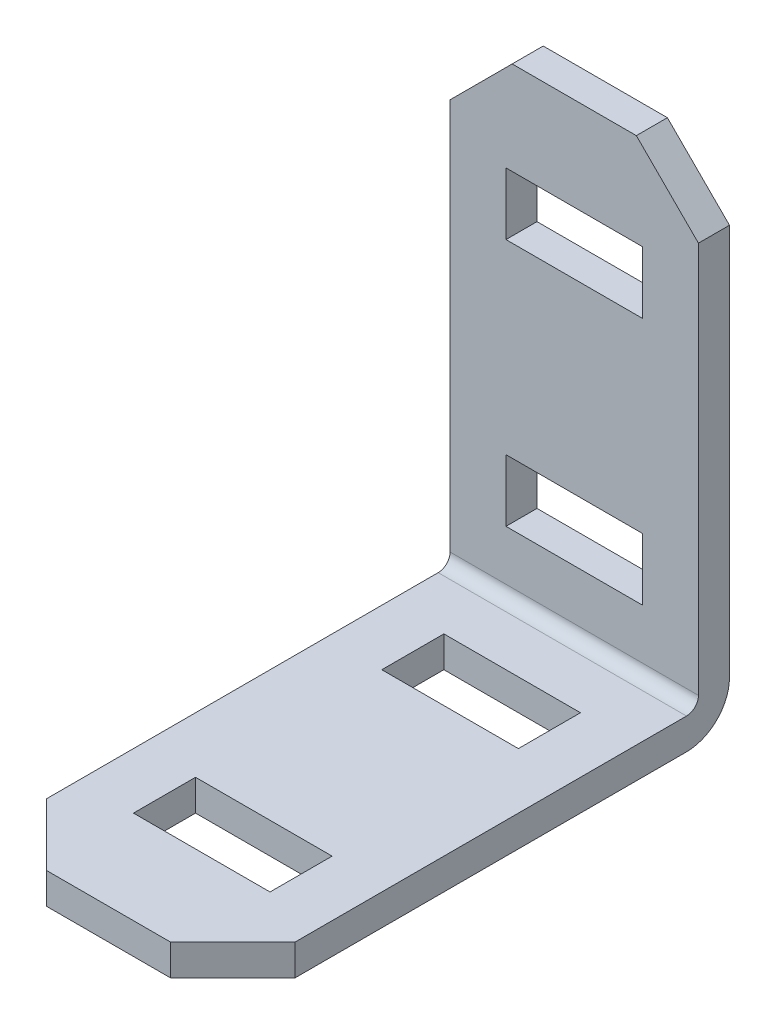
ISO-10303-21;
HEADER;
FILE_DESCRIPTION(('STEP AP214'),'2;1');
FILE_NAME('part.step','',(''),(''),'','','');
FILE_SCHEMA(('AUTOMOTIVE_DESIGN { 1 0 10303 214 1 1 1 1 }'));
ENDSEC;
DATA;
#1=APPLICATION_CONTEXT('core data for automotive mechanical design processes');
#2=APPLICATION_PROTOCOL_DEFINITION('international standard','automotive_design',2000,#1);
#3=PRODUCT_CONTEXT('',#1,'mechanical');
#4=PRODUCT('Part','Part','',(#3));
#5=PRODUCT_RELATED_PRODUCT_CATEGORY('part','',(#4));
#6=PRODUCT_DEFINITION_FORMATION('','',#4);
#7=PRODUCT_DEFINITION_CONTEXT('part definition',#1,'design');
#8=PRODUCT_DEFINITION('design','',#6,#7);
#9=PRODUCT_DEFINITION_SHAPE('','',#8);
#10=(LENGTH_UNIT() NAMED_UNIT(*) SI_UNIT(.MILLI.,.METRE.));
#11=(NAMED_UNIT(*) PLANE_ANGLE_UNIT() SI_UNIT($,.RADIAN.));
#12=(NAMED_UNIT(*) SI_UNIT($,.STERADIAN.) SOLID_ANGLE_UNIT());
#13=UNCERTAINTY_MEASURE_WITH_UNIT(LENGTH_MEASURE(1.E-05),#10,'distance_accuracy_value','');
#14=(GEOMETRIC_REPRESENTATION_CONTEXT(3) GLOBAL_UNCERTAINTY_ASSIGNED_CONTEXT((#13)) GLOBAL_UNIT_ASSIGNED_CONTEXT((#10,
#11,#12)) REPRESENTATION_CONTEXT('',''));
#15=CARTESIAN_POINT('',(0.,0.,0.));
#16=DIRECTION('',(0.,0.,1.));
#17=DIRECTION('',(1.,0.,0.));
#18=AXIS2_PLACEMENT_3D('',#15,#16,#17);
#19=CARTESIAN_POINT('',(0.,0.,0.));
#20=DIRECTION('',(0.,1.,0.));
#21=DIRECTION('',(0.,0.,1.));
#22=AXIS2_PLACEMENT_3D('',#19,#20,#21);
#23=PLANE('',#22);
#24=DIRECTION('',(-0.707106781186549,0.,0.707106781186546));
#25=VECTOR('',#24,1.);
#26=CARTESIAN_POINT('',(25.4,0.,-6.35000000000002));
#27=LINE('',#26,#25);
#28=CARTESIAN_POINT('',(25.4,0.,-6.35000000000002));
#29=VERTEX_POINT('',#28);
#30=CARTESIAN_POINT('',(19.0499999999999,0.,0.));
#31=VERTEX_POINT('',#30);
#32=EDGE_CURVE('E249',#29,#31,#27,.T.);
#33=ORIENTED_EDGE('',*,*,#32,.T.);
#34=DIRECTION('',(-1.,0.,0.));
#35=VECTOR('',#34,1.);
#36=CARTESIAN_POINT('',(0.,0.,0.));
#37=LINE('',#36,#35);
#38=CARTESIAN_POINT('',(6.35000000000001,0.,0.));
#39=VERTEX_POINT('',#38);
#40=EDGE_CURVE('E262',#31,#39,#37,.T.);
#41=ORIENTED_EDGE('',*,*,#40,.T.);
#42=DIRECTION('',(-0.707106781186547,0.,-0.707106781186548));
#43=VECTOR('',#42,1.);
#44=CARTESIAN_POINT('',(6.35000000000001,0.,0.));
#45=LINE('',#44,#43);
#46=CARTESIAN_POINT('',(0.,0.,-6.35000000000003));
#47=VERTEX_POINT('',#46);
#48=EDGE_CURVE('E62',#39,#47,#45,.T.);
#49=ORIENTED_EDGE('',*,*,#48,.T.);
#50=DIRECTION('',(0.,0.,-1.));
#51=VECTOR('',#50,1.);
#52=CARTESIAN_POINT('',(0.,0.,-50.8));
#53=LINE('',#52,#51);
#54=CARTESIAN_POINT('',(0.,0.,-46.4058));
#55=VERTEX_POINT('',#54);
#56=EDGE_CURVE('E56',#47,#55,#53,.T.);
#57=ORIENTED_EDGE('',*,*,#56,.T.);
#58=DIRECTION('',(-1.,0.,0.));
#59=VECTOR('',#58,1.);
#60=CARTESIAN_POINT('',(0.,0.,-46.4058));
#61=LINE('',#60,#59);
#62=CARTESIAN_POINT('',(25.4,0.,-46.4058));
#63=VERTEX_POINT('',#62);
#64=EDGE_CURVE('E300',#63,#55,#61,.T.);
#65=ORIENTED_EDGE('',*,*,#64,.F.);
#66=DIRECTION('',(0.,0.,1.));
#67=VECTOR('',#66,1.);
#68=CARTESIAN_POINT('',(25.4,0.,-50.8));
#69=LINE('',#68,#67);
#70=EDGE_CURVE('E239',#63,#29,#69,.T.);
#71=ORIENTED_EDGE('',*,*,#70,.T.);
#72=EDGE_LOOP('',(#33,#41,#49,#57,#65,#71));
#73=FACE_BOUND('',#72,.T.);
#74=DIRECTION('',(0.,0.,-1.));
#75=VECTOR('',#74,1.);
#76=CARTESIAN_POINT('',(19.685,0.,-15.875));
#77=LINE('',#76,#75);
#78=CARTESIAN_POINT('',(19.685,0.,-9.525));
#79=VERTEX_POINT('',#78);
#80=CARTESIAN_POINT('',(19.685,0.,-15.875));
#81=VERTEX_POINT('',#80);
#82=EDGE_CURVE('E278',#79,#81,#77,.T.);
#83=ORIENTED_EDGE('',*,*,#82,.T.);
#84=DIRECTION('',(-1.,0.,0.));
#85=VECTOR('',#84,1.);
#86=CARTESIAN_POINT('',(19.685,0.,-15.875));
#87=LINE('',#86,#85);
#88=CARTESIAN_POINT('',(5.71499999999999,0.,-15.875));
#89=VERTEX_POINT('',#88);
#90=EDGE_CURVE('E259',#81,#89,#87,.T.);
#91=ORIENTED_EDGE('',*,*,#90,.T.);
#92=DIRECTION('',(0.,0.,1.));
#93=VECTOR('',#92,1.);
#94=CARTESIAN_POINT('',(5.71499999999999,0.,-15.875));
#95=LINE('',#94,#93);
#96=CARTESIAN_POINT('',(5.71499999999999,0.,-9.525));
#97=VERTEX_POINT('',#96);
#98=EDGE_CURVE('E268',#89,#97,#95,.T.);
#99=ORIENTED_EDGE('',*,*,#98,.T.);
#100=DIRECTION('',(1.,0.,0.));
#101=VECTOR('',#100,1.);
#102=CARTESIAN_POINT('',(19.685,0.,-9.525));
#103=LINE('',#102,#101);
#104=EDGE_CURVE('E273',#97,#79,#103,.T.);
#105=ORIENTED_EDGE('',*,*,#104,.T.);
#106=EDGE_LOOP('',(#83,#91,#99,#105));
#107=FACE_BOUND('',#106,.T.);
#108=DIRECTION('',(0.,0.,-1.));
#109=VECTOR('',#108,1.);
#110=CARTESIAN_POINT('',(19.685,0.,-41.275));
#111=LINE('',#110,#109);
#112=CARTESIAN_POINT('',(19.685,0.,-34.925));
#113=VERTEX_POINT('',#112);
#114=CARTESIAN_POINT('',(19.685,0.,-41.275));
#115=VERTEX_POINT('',#114);
#116=EDGE_CURVE('E298',#113,#115,#111,.T.);
#117=ORIENTED_EDGE('',*,*,#116,.T.);
#118=DIRECTION('',(-1.,0.,0.));
#119=VECTOR('',#118,1.);
#120=CARTESIAN_POINT('',(19.685,0.,-41.275));
#121=LINE('',#120,#119);
#122=CARTESIAN_POINT('',(5.71499999999999,0.,-41.275));
#123=VERTEX_POINT('',#122);
#124=EDGE_CURVE('E280',#115,#123,#121,.T.);
#125=ORIENTED_EDGE('',*,*,#124,.T.);
#126=DIRECTION('',(0.,0.,1.));
#127=VECTOR('',#126,1.);
#128=CARTESIAN_POINT('',(5.71499999999999,0.,-41.275));
#129=LINE('',#128,#127);
#130=CARTESIAN_POINT('',(5.71499999999999,0.,-34.925));
#131=VERTEX_POINT('',#130);
#132=EDGE_CURVE('E288',#123,#131,#129,.T.);
#133=ORIENTED_EDGE('',*,*,#132,.T.);
#134=DIRECTION('',(1.,0.,0.));
#135=VECTOR('',#134,1.);
#136=CARTESIAN_POINT('',(19.685,0.,-34.925));
#137=LINE('',#136,#135);
#138=EDGE_CURVE('E293',#131,#113,#137,.T.);
#139=ORIENTED_EDGE('',*,*,#138,.T.);
#140=EDGE_LOOP('',(#117,#125,#133,#139));
#141=FACE_BOUND('',#140,.T.);
#142=ADVANCED_FACE('F15',(#73,#107,#141),#23,.F.);
#143=CARTESIAN_POINT('',(0.,4.39419999999999,-46.4058));
#144=DIRECTION('',(-1.,0.,0.));
#145=DIRECTION('',(0.,0.,1.));
#146=AXIS2_PLACEMENT_3D('',#143,#144,#145);
#147=CYLINDRICAL_SURFACE('',#146,4.39419999999999);
#148=DIRECTION('',(1.,0.,0.));
#149=VECTOR('',#148,1.);
#150=CARTESIAN_POINT('',(25.4,4.39420000000001,-50.8));
#151=LINE('',#150,#149);
#152=CARTESIAN_POINT('',(0.,4.3942,-50.8));
#153=VERTEX_POINT('',#152);
#154=CARTESIAN_POINT('',(25.4,4.39419999999999,-50.8000000000001));
#155=VERTEX_POINT('',#154);
#156=EDGE_CURVE('E196',#153,#155,#151,.T.);
#157=ORIENTED_EDGE('',*,*,#156,.T.);
#158=CARTESIAN_POINT('',(25.4,4.39419999999999,-46.4058));
#159=DIRECTION('',(-1.,0.,0.));
#160=DIRECTION('',(0.,0.,1.));
#161=AXIS2_PLACEMENT_3D('',#158,#159,#160);
#162=CIRCLE('',#161,4.39419999999999);
#163=EDGE_CURVE('E318',#63,#155,#162,.F.);
#164=ORIENTED_EDGE('',*,*,#163,.F.);
#165=ORIENTED_EDGE('',*,*,#64,.T.);
#166=CARTESIAN_POINT('',(0.,4.39419999999999,-46.4058));
#167=DIRECTION('',(-1.,0.,0.));
#168=DIRECTION('',(0.,0.,1.));
#169=AXIS2_PLACEMENT_3D('',#166,#167,#168);
#170=CIRCLE('',#169,4.39419999999999);
#171=EDGE_CURVE('E18',#55,#153,#170,.F.);
#172=ORIENTED_EDGE('',*,*,#171,.T.);
#173=EDGE_LOOP('',(#157,#164,#165,#172));
#174=FACE_BOUND('',#173,.T.);
#175=ADVANCED_FACE('F327',(#174),#147,.T.);
#176=CARTESIAN_POINT('',(19.685,3.175,-41.275));
#177=DIRECTION('',(1.,0.,0.));
#178=DIRECTION('',(0.,0.,-1.));
#179=AXIS2_PLACEMENT_3D('',#176,#177,#178);
#180=PLANE('',#179);
#181=DIRECTION('',(0.,1.,0.));
#182=VECTOR('',#181,1.);
#183=CARTESIAN_POINT('',(19.685,3.175,-34.925));
#184=LINE('',#183,#182);
#185=CARTESIAN_POINT('',(19.685,3.175,-34.925));
#186=VERTEX_POINT('',#185);
#187=EDGE_CURVE('E296',#113,#186,#184,.T.);
#188=ORIENTED_EDGE('',*,*,#187,.T.);
#189=DIRECTION('',(0.,0.,1.));
#190=VECTOR('',#189,1.);
#191=CARTESIAN_POINT('',(19.685,3.175,0.));
#192=LINE('',#191,#190);
#193=CARTESIAN_POINT('',(19.685,3.175,-41.275));
#194=VERTEX_POINT('',#193);
#195=EDGE_CURVE('E320',#194,#186,#192,.T.);
#196=ORIENTED_EDGE('',*,*,#195,.F.);
#197=DIRECTION('',(0.,1.,0.));
#198=VECTOR('',#197,1.);
#199=CARTESIAN_POINT('',(19.685,3.175,-41.275));
#200=LINE('',#199,#198);
#201=EDGE_CURVE('E283',#194,#115,#200,.F.);
#202=ORIENTED_EDGE('',*,*,#201,.T.);
#203=ORIENTED_EDGE('',*,*,#116,.F.);
#204=EDGE_LOOP('',(#188,#196,#202,#203));
#205=FACE_BOUND('',#204,.T.);
#206=ADVANCED_FACE('F578',(#205),#180,.F.);
#207=CARTESIAN_POINT('',(19.685,3.175,-34.925));
#208=DIRECTION('',(0.,0.,1.));
#209=DIRECTION('',(1.,0.,0.));
#210=AXIS2_PLACEMENT_3D('',#207,#208,#209);
#211=PLANE('',#210);
#212=DIRECTION('',(0.,1.,0.));
#213=VECTOR('',#212,1.);
#214=CARTESIAN_POINT('',(5.71499999999999,3.175,-34.925));
#215=LINE('',#214,#213);
#216=CARTESIAN_POINT('',(5.71499999999999,3.175,-34.925));
#217=VERTEX_POINT('',#216);
#218=EDGE_CURVE('E291',#131,#217,#215,.T.);
#219=ORIENTED_EDGE('',*,*,#218,.T.);
#220=DIRECTION('',(1.,0.,0.));
#221=VECTOR('',#220,1.);
#222=CARTESIAN_POINT('',(0.,3.175,-34.925));
#223=LINE('',#222,#221);
#224=EDGE_CURVE('E324',#186,#217,#223,.F.);
#225=ORIENTED_EDGE('',*,*,#224,.F.);
#226=ORIENTED_EDGE('',*,*,#187,.F.);
#227=ORIENTED_EDGE('',*,*,#138,.F.);
#228=EDGE_LOOP('',(#219,#225,#226,#227));
#229=FACE_BOUND('',#228,.T.);
#230=ADVANCED_FACE('F574',(#229),#211,.F.);
#231=CARTESIAN_POINT('',(5.71499999999999,3.175,-41.275));
#232=DIRECTION('',(-1.,0.,0.));
#233=DIRECTION('',(0.,0.,1.));
#234=AXIS2_PLACEMENT_3D('',#231,#232,#233);
#235=PLANE('',#234);
#236=DIRECTION('',(0.,1.,0.));
#237=VECTOR('',#236,1.);
#238=CARTESIAN_POINT('',(5.71499999999999,3.175,-41.275));
#239=LINE('',#238,#237);
#240=CARTESIAN_POINT('',(5.71499999999999,3.175,-41.275));
#241=VERTEX_POINT('',#240);
#242=EDGE_CURVE('E286',#123,#241,#239,.T.);
#243=ORIENTED_EDGE('',*,*,#242,.T.);
#244=DIRECTION('',(0.,0.,1.));
#245=VECTOR('',#244,1.);
#246=CARTESIAN_POINT('',(5.71499999999999,3.175,0.));
#247=LINE('',#246,#245);
#248=EDGE_CURVE('E404',#217,#241,#247,.F.);
#249=ORIENTED_EDGE('',*,*,#248,.F.);
#250=ORIENTED_EDGE('',*,*,#218,.F.);
#251=ORIENTED_EDGE('',*,*,#132,.F.);
#252=EDGE_LOOP('',(#243,#249,#250,#251));
#253=FACE_BOUND('',#252,.T.);
#254=ADVANCED_FACE('F570',(#253),#235,.F.);
#255=CARTESIAN_POINT('',(19.685,3.175,-41.275));
#256=DIRECTION('',(0.,0.,-1.));
#257=DIRECTION('',(-1.,0.,0.));
#258=AXIS2_PLACEMENT_3D('',#255,#256,#257);
#259=PLANE('',#258);
#260=ORIENTED_EDGE('',*,*,#201,.F.);
#261=DIRECTION('',(1.,0.,0.));
#262=VECTOR('',#261,1.);
#263=CARTESIAN_POINT('',(0.,3.175,-41.275));
#264=LINE('',#263,#262);
#265=EDGE_CURVE('E401',#241,#194,#264,.T.);
#266=ORIENTED_EDGE('',*,*,#265,.F.);
#267=ORIENTED_EDGE('',*,*,#242,.F.);
#268=ORIENTED_EDGE('',*,*,#124,.F.);
#269=EDGE_LOOP('',(#260,#266,#267,#268));
#270=FACE_BOUND('',#269,.T.);
#271=ADVANCED_FACE('F566',(#270),#259,.F.);
#272=CARTESIAN_POINT('',(19.685,3.175,-15.875));
#273=DIRECTION('',(1.,0.,0.));
#274=DIRECTION('',(0.,0.,-1.));
#275=AXIS2_PLACEMENT_3D('',#272,#273,#274);
#276=PLANE('',#275);
#277=DIRECTION('',(0.,1.,0.));
#278=VECTOR('',#277,1.);
#279=CARTESIAN_POINT('',(19.685,3.175,-9.525));
#280=LINE('',#279,#278);
#281=CARTESIAN_POINT('',(19.685,3.175,-9.525));
#282=VERTEX_POINT('',#281);
#283=EDGE_CURVE('E276',#79,#282,#280,.T.);
#284=ORIENTED_EDGE('',*,*,#283,.T.);
#285=DIRECTION('',(0.,0.,1.));
#286=VECTOR('',#285,1.);
#287=CARTESIAN_POINT('',(19.685,3.175,0.));
#288=LINE('',#287,#286);
#289=CARTESIAN_POINT('',(19.685,3.175,-15.875));
#290=VERTEX_POINT('',#289);
#291=EDGE_CURVE('E398',#290,#282,#288,.T.);
#292=ORIENTED_EDGE('',*,*,#291,.F.);
#293=DIRECTION('',(0.,1.,0.));
#294=VECTOR('',#293,1.);
#295=CARTESIAN_POINT('',(19.685,3.175,-15.875));
#296=LINE('',#295,#294);
#297=EDGE_CURVE('E263',#290,#81,#296,.F.);
#298=ORIENTED_EDGE('',*,*,#297,.T.);
#299=ORIENTED_EDGE('',*,*,#82,.F.);
#300=EDGE_LOOP('',(#284,#292,#298,#299));
#301=FACE_BOUND('',#300,.T.);
#302=ADVANCED_FACE('F562',(#301),#276,.F.);
#303=CARTESIAN_POINT('',(19.685,3.175,-9.525));
#304=DIRECTION('',(0.,0.,1.));
#305=DIRECTION('',(1.,0.,0.));
#306=AXIS2_PLACEMENT_3D('',#303,#304,#305);
#307=PLANE('',#306);
#308=DIRECTION('',(0.,1.,0.));
#309=VECTOR('',#308,1.);
#310=CARTESIAN_POINT('',(5.71499999999999,3.175,-9.525));
#311=LINE('',#310,#309);
#312=CARTESIAN_POINT('',(5.71499999999999,3.175,-9.525));
#313=VERTEX_POINT('',#312);
#314=EDGE_CURVE('E271',#97,#313,#311,.T.);
#315=ORIENTED_EDGE('',*,*,#314,.T.);
#316=DIRECTION('',(1.,0.,0.));
#317=VECTOR('',#316,1.);
#318=CARTESIAN_POINT('',(0.,3.175,-9.525));
#319=LINE('',#318,#317);
#320=EDGE_CURVE('E395',#282,#313,#319,.F.);
#321=ORIENTED_EDGE('',*,*,#320,.F.);
#322=ORIENTED_EDGE('',*,*,#283,.F.);
#323=ORIENTED_EDGE('',*,*,#104,.F.);
#324=EDGE_LOOP('',(#315,#321,#322,#323));
#325=FACE_BOUND('',#324,.T.);
#326=ADVANCED_FACE('F558',(#325),#307,.F.);
#327=CARTESIAN_POINT('',(5.71499999999999,3.175,-15.875));
#328=DIRECTION('',(-1.,0.,0.));
#329=DIRECTION('',(0.,0.,1.));
#330=AXIS2_PLACEMENT_3D('',#327,#328,#329);
#331=PLANE('',#330);
#332=DIRECTION('',(0.,1.,0.));
#333=VECTOR('',#332,1.);
#334=CARTESIAN_POINT('',(5.71499999999999,3.175,-15.875));
#335=LINE('',#334,#333);
#336=CARTESIAN_POINT('',(5.71499999999999,3.175,-15.875));
#337=VERTEX_POINT('',#336);
#338=EDGE_CURVE('E266',#89,#337,#335,.T.);
#339=ORIENTED_EDGE('',*,*,#338,.T.);
#340=DIRECTION('',(0.,0.,1.));
#341=VECTOR('',#340,1.);
#342=CARTESIAN_POINT('',(5.71499999999999,3.175,0.));
#343=LINE('',#342,#341);
#344=EDGE_CURVE('E392',#313,#337,#343,.F.);
#345=ORIENTED_EDGE('',*,*,#344,.F.);
#346=ORIENTED_EDGE('',*,*,#314,.F.);
#347=ORIENTED_EDGE('',*,*,#98,.F.);
#348=EDGE_LOOP('',(#339,#345,#346,#347));
#349=FACE_BOUND('',#348,.T.);
#350=ADVANCED_FACE('F554',(#349),#331,.F.);
#351=CARTESIAN_POINT('',(19.685,3.175,-15.875));
#352=DIRECTION('',(0.,0.,-1.));
#353=DIRECTION('',(-1.,0.,0.));
#354=AXIS2_PLACEMENT_3D('',#351,#352,#353);
#355=PLANE('',#354);
#356=ORIENTED_EDGE('',*,*,#297,.F.);
#357=DIRECTION('',(1.,0.,0.));
#358=VECTOR('',#357,1.);
#359=CARTESIAN_POINT('',(0.,3.175,-15.875));
#360=LINE('',#359,#358);
#361=EDGE_CURVE('E253',#337,#290,#360,.T.);
#362=ORIENTED_EDGE('',*,*,#361,.F.);
#363=ORIENTED_EDGE('',*,*,#338,.F.);
#364=ORIENTED_EDGE('',*,*,#90,.F.);
#365=EDGE_LOOP('',(#356,#362,#363,#364));
#366=FACE_BOUND('',#365,.T.);
#367=ADVANCED_FACE('F550',(#366),#355,.F.);
#368=CARTESIAN_POINT('',(0.,3.175,0.));
#369=DIRECTION('',(0.,0.,-1.));
#370=DIRECTION('',(-1.,0.,0.));
#371=AXIS2_PLACEMENT_3D('',#368,#369,#370);
#372=PLANE('',#371);
#373=DIRECTION('',(0.,1.,0.));
#374=VECTOR('',#373,1.);
#375=CARTESIAN_POINT('',(19.0499999999999,3.175,0.));
#376=LINE('',#375,#374);
#377=CARTESIAN_POINT('',(19.0499999999999,3.175,0.));
#378=VERTEX_POINT('',#377);
#379=EDGE_CURVE('E247',#31,#378,#376,.T.);
#380=ORIENTED_EDGE('',*,*,#379,.T.);
#381=DIRECTION('',(1.,0.,0.));
#382=VECTOR('',#381,1.);
#383=CARTESIAN_POINT('',(0.,3.175,0.));
#384=LINE('',#383,#382);
#385=CARTESIAN_POINT('',(6.35000000000001,3.175,0.));
#386=VERTEX_POINT('',#385);
#387=EDGE_CURVE('E244',#386,#378,#384,.T.);
#388=ORIENTED_EDGE('',*,*,#387,.F.);
#389=DIRECTION('',(0.,1.,0.));
#390=VECTOR('',#389,1.);
#391=CARTESIAN_POINT('',(6.35000000000001,3.175,0.));
#392=LINE('',#391,#390);
#393=EDGE_CURVE('E203',#386,#39,#392,.F.);
#394=ORIENTED_EDGE('',*,*,#393,.T.);
#395=ORIENTED_EDGE('',*,*,#40,.F.);
#396=EDGE_LOOP('',(#380,#388,#394,#395));
#397=FACE_BOUND('',#396,.T.);
#398=ADVANCED_FACE('F546',(#397),#372,.F.);
#399=CARTESIAN_POINT('',(25.4,3.175,-6.35000000000002));
#400=DIRECTION('',(-0.707106781186546,0.,-0.707106781186549));
#401=DIRECTION('',(-0.707106781186549,0.,0.707106781186546));
#402=AXIS2_PLACEMENT_3D('',#399,#400,#401);
#403=PLANE('',#402);
#404=ORIENTED_EDGE('',*,*,#379,.F.);
#405=ORIENTED_EDGE('',*,*,#32,.F.);
#406=DIRECTION('',(0.,1.,0.));
#407=VECTOR('',#406,1.);
#408=CARTESIAN_POINT('',(25.4,3.175,-6.35000000000002));
#409=LINE('',#408,#407);
#410=CARTESIAN_POINT('',(25.4,3.175,-6.35000000000001));
#411=VERTEX_POINT('',#410);
#412=EDGE_CURVE('E237',#29,#411,#409,.T.);
#413=ORIENTED_EDGE('',*,*,#412,.T.);
#414=DIRECTION('',(0.707106781186549,0.,-0.707106781186546));
#415=VECTOR('',#414,1.);
#416=CARTESIAN_POINT('',(19.0499999999999,3.175,0.));
#417=LINE('',#416,#415);
#418=EDGE_CURVE('E214',#378,#411,#417,.T.);
#419=ORIENTED_EDGE('',*,*,#418,.F.);
#420=EDGE_LOOP('',(#404,#405,#413,#419));
#421=FACE_BOUND('',#420,.T.);
#422=ADVANCED_FACE('F543',(#421),#403,.F.);
#423=CARTESIAN_POINT('',(6.35000000000001,3.175,0.));
#424=DIRECTION('',(0.707106781186548,0.,-0.707106781186547));
#425=DIRECTION('',(-0.707106781186547,0.,-0.707106781186548));
#426=AXIS2_PLACEMENT_3D('',#423,#424,#425);
#427=PLANE('',#426);
#428=DIRECTION('',(0.,1.,0.));
#429=VECTOR('',#428,1.);
#430=CARTESIAN_POINT('',(0.,3.175,-6.35000000000002));
#431=LINE('',#430,#429);
#432=CARTESIAN_POINT('',(0.,3.175,-6.35000000000002));
#433=VERTEX_POINT('',#432);
#434=EDGE_CURVE('E190',#47,#433,#431,.T.);
#435=ORIENTED_EDGE('',*,*,#434,.F.);
#436=ORIENTED_EDGE('',*,*,#48,.F.);
#437=ORIENTED_EDGE('',*,*,#393,.F.);
#438=DIRECTION('',(0.707106781186546,0.,0.707106781186549));
#439=VECTOR('',#438,1.);
#440=CARTESIAN_POINT('',(0.,3.175,-6.35000000000003));
#441=LINE('',#440,#439);
#442=EDGE_CURVE('E200',#433,#386,#441,.T.);
#443=ORIENTED_EDGE('',*,*,#442,.F.);
#444=EDGE_LOOP('',(#435,#436,#437,#443));
#445=FACE_BOUND('',#444,.T.);
#446=ADVANCED_FACE('F201',(#445),#427,.F.);
#447=CARTESIAN_POINT('',(25.4,50.8,-50.8000000000002));
#448=DIRECTION('',(0.,0.,1.));
#449=DIRECTION('',(0.,-1.,0.));
#450=AXIS2_PLACEMENT_3D('',#447,#448,#449);
#451=PLANE('',#450);
#452=DIRECTION('',(0.707106781186549,-0.707106781186546,0.));
#453=VECTOR('',#452,1.);
#454=CARTESIAN_POINT('',(25.4,44.45,-50.8000000000002));
#455=LINE('',#454,#453);
#456=CARTESIAN_POINT('',(19.05,50.8,-50.8000000000002));
#457=VERTEX_POINT('',#456);
#458=CARTESIAN_POINT('',(25.4,44.45,-50.8000000000002));
#459=VERTEX_POINT('',#458);
#460=EDGE_CURVE('E348',#457,#459,#455,.T.);
#461=ORIENTED_EDGE('',*,*,#460,.T.);
#462=DIRECTION('',(0.,1.,0.));
#463=VECTOR('',#462,1.);
#464=CARTESIAN_POINT('',(25.4,3.17499999999999,-50.8000000000001));
#465=LINE('',#464,#463);
#466=EDGE_CURVE('E228',#459,#155,#465,.F.);
#467=ORIENTED_EDGE('',*,*,#466,.T.);
#468=ORIENTED_EDGE('',*,*,#156,.F.);
#469=DIRECTION('',(0.,1.,0.));
#470=VECTOR('',#469,1.);
#471=CARTESIAN_POINT('',(0.,50.8,-50.8));
#472=LINE('',#471,#470);
#473=CARTESIAN_POINT('',(0.,44.45,-50.8000000000001));
#474=VERTEX_POINT('',#473);
#475=EDGE_CURVE('E108',#153,#474,#472,.T.);
#476=ORIENTED_EDGE('',*,*,#475,.T.);
#477=DIRECTION('',(0.707106781186546,0.707106781186549,0.));
#478=VECTOR('',#477,1.);
#479=CARTESIAN_POINT('',(6.35000000000002,50.8,-50.8000000000001));
#480=LINE('',#479,#478);
#481=CARTESIAN_POINT('',(6.35000000000002,50.8,-50.8000000000002));
#482=VERTEX_POINT('',#481);
#483=EDGE_CURVE('E227',#474,#482,#480,.T.);
#484=ORIENTED_EDGE('',*,*,#483,.T.);
#485=DIRECTION('',(1.,0.,0.));
#486=VECTOR('',#485,1.);
#487=CARTESIAN_POINT('',(25.4,50.8,-50.8000000000002));
#488=LINE('',#487,#486);
#489=EDGE_CURVE('E346',#482,#457,#488,.T.);
#490=ORIENTED_EDGE('',*,*,#489,.T.);
#491=EDGE_LOOP('',(#461,#467,#468,#476,#484,#490));
#492=FACE_BOUND('',#491,.T.);
#493=DIRECTION('',(0.,1.,0.));
#494=VECTOR('',#493,1.);
#495=CARTESIAN_POINT('',(5.71499999999999,41.275,-50.8));
#496=LINE('',#495,#494);
#497=CARTESIAN_POINT('',(5.71499999999999,41.275,-50.8000000000001));
#498=VERTEX_POINT('',#497);
#499=CARTESIAN_POINT('',(5.71499999999999,34.925,-50.8));
#500=VERTEX_POINT('',#499);
#501=EDGE_CURVE('E369',#498,#500,#496,.F.);
#502=ORIENTED_EDGE('',*,*,#501,.T.);
#503=DIRECTION('',(1.,0.,0.));
#504=VECTOR('',#503,1.);
#505=CARTESIAN_POINT('',(5.71499999999999,34.925,-50.8));
#506=LINE('',#505,#504);
#507=CARTESIAN_POINT('',(19.685,34.925,-50.8000000000001));
#508=VERTEX_POINT('',#507);
#509=EDGE_CURVE('E354',#500,#508,#506,.T.);
#510=ORIENTED_EDGE('',*,*,#509,.T.);
#511=DIRECTION('',(0.,1.,0.));
#512=VECTOR('',#511,1.);
#513=CARTESIAN_POINT('',(19.685,41.275,-50.8000000000001));
#514=LINE('',#513,#512);
#515=CARTESIAN_POINT('',(19.685,41.275,-50.8000000000001));
#516=VERTEX_POINT('',#515);
#517=EDGE_CURVE('E362',#508,#516,#514,.T.);
#518=ORIENTED_EDGE('',*,*,#517,.T.);
#519=DIRECTION('',(1.,0.,0.));
#520=VECTOR('',#519,1.);
#521=CARTESIAN_POINT('',(5.71499999999999,41.275,-50.8));
#522=LINE('',#521,#520);
#523=EDGE_CURVE('E367',#516,#498,#522,.F.);
#524=ORIENTED_EDGE('',*,*,#523,.T.);
#525=EDGE_LOOP('',(#502,#510,#518,#524));
#526=FACE_BOUND('',#525,.T.);
#527=DIRECTION('',(0.,1.,0.));
#528=VECTOR('',#527,1.);
#529=CARTESIAN_POINT('',(5.71499999999997,15.875,-50.7999999999999));
#530=LINE('',#529,#528);
#531=CARTESIAN_POINT('',(5.71499999999998,15.875,-50.8));
#532=VERTEX_POINT('',#531);
#533=CARTESIAN_POINT('',(5.71499999999998,9.52500000000001,-50.7999999999999));
#534=VERTEX_POINT('',#533);
#535=EDGE_CURVE('E206',#532,#534,#530,.F.);
#536=ORIENTED_EDGE('',*,*,#535,.T.);
#537=DIRECTION('',(1.,0.,0.));
#538=VECTOR('',#537,1.);
#539=CARTESIAN_POINT('',(5.71499999999997,9.52500000000001,-50.7999999999999));
#540=LINE('',#539,#538);
#541=CARTESIAN_POINT('',(19.685,9.52500000000001,-50.8));
#542=VERTEX_POINT('',#541);
#543=EDGE_CURVE('E374',#534,#542,#540,.T.);
#544=ORIENTED_EDGE('',*,*,#543,.T.);
#545=DIRECTION('',(0.,1.,0.));
#546=VECTOR('',#545,1.);
#547=CARTESIAN_POINT('',(19.685,15.875,-50.8));
#548=LINE('',#547,#546);
#549=CARTESIAN_POINT('',(19.685,15.875,-50.8));
#550=VERTEX_POINT('',#549);
#551=EDGE_CURVE('E382',#542,#550,#548,.T.);
#552=ORIENTED_EDGE('',*,*,#551,.T.);
#553=DIRECTION('',(1.,0.,0.));
#554=VECTOR('',#553,1.);
#555=CARTESIAN_POINT('',(5.71499999999997,15.875,-50.7999999999999));
#556=LINE('',#555,#554);
#557=EDGE_CURVE('E387',#550,#532,#556,.F.);
#558=ORIENTED_EDGE('',*,*,#557,.T.);
#559=EDGE_LOOP('',(#536,#544,#552,#558));
#560=FACE_BOUND('',#559,.T.);
#561=ADVANCED_FACE('F329',(#492,#526,#560),#451,.F.);
#562=CARTESIAN_POINT('',(0.,3.175,0.));
#563=DIRECTION('',(0.,1.,0.));
#564=DIRECTION('',(0.,0.,1.));
#565=AXIS2_PLACEMENT_3D('',#562,#563,#564);
#566=PLANE('',#565);
#567=DIRECTION('',(0.,0.,1.));
#568=VECTOR('',#567,1.);
#569=CARTESIAN_POINT('',(0.,3.175,0.));
#570=LINE('',#569,#568);
#571=CARTESIAN_POINT('',(0.,3.17499999999999,-46.4058));
#572=VERTEX_POINT('',#571);
#573=EDGE_CURVE('E100',#572,#433,#570,.T.);
#574=ORIENTED_EDGE('',*,*,#573,.T.);
#575=ORIENTED_EDGE('',*,*,#442,.T.);
#576=ORIENTED_EDGE('',*,*,#387,.T.);
#577=ORIENTED_EDGE('',*,*,#418,.T.);
#578=DIRECTION('',(0.,0.,1.));
#579=VECTOR('',#578,1.);
#580=CARTESIAN_POINT('',(25.4,3.175,0.));
#581=LINE('',#580,#579);
#582=CARTESIAN_POINT('',(25.4,3.17499999999999,-46.4058));
#583=VERTEX_POINT('',#582);
#584=EDGE_CURVE('E212',#411,#583,#581,.F.);
#585=ORIENTED_EDGE('',*,*,#584,.T.);
#586=DIRECTION('',(-1.,0.,0.));
#587=VECTOR('',#586,1.);
#588=CARTESIAN_POINT('',(0.,3.17499999999999,-46.4058));
#589=LINE('',#588,#587);
#590=EDGE_CURVE('E211',#583,#572,#589,.T.);
#591=ORIENTED_EDGE('',*,*,#590,.T.);
#592=EDGE_LOOP('',(#574,#575,#576,#577,#585,#591));
#593=FACE_BOUND('',#592,.T.);
#594=ORIENTED_EDGE('',*,*,#344,.T.);
#595=ORIENTED_EDGE('',*,*,#361,.T.);
#596=ORIENTED_EDGE('',*,*,#291,.T.);
#597=ORIENTED_EDGE('',*,*,#320,.T.);
#598=EDGE_LOOP('',(#594,#595,#596,#597));
#599=FACE_BOUND('',#598,.T.);
#600=ORIENTED_EDGE('',*,*,#248,.T.);
#601=ORIENTED_EDGE('',*,*,#265,.T.);
#602=ORIENTED_EDGE('',*,*,#195,.T.);
#603=ORIENTED_EDGE('',*,*,#224,.T.);
#604=EDGE_LOOP('',(#600,#601,#602,#603));
#605=FACE_BOUND('',#604,.T.);
#606=ADVANCED_FACE('F208',(#593,#599,#605),#566,.T.);
#607=CARTESIAN_POINT('',(5.71499999999997,15.875,-50.7999999999999));
#608=DIRECTION('',(-1.,0.,0.));
#609=DIRECTION('',(0.,0.,1.));
#610=AXIS2_PLACEMENT_3D('',#607,#608,#609);
#611=PLANE('',#610);
#612=DIRECTION('',(0.,0.,-1.));
#613=VECTOR('',#612,1.);
#614=CARTESIAN_POINT('',(5.71499999999998,9.52500000000001,-50.7999999999999));
#615=LINE('',#614,#613);
#616=CARTESIAN_POINT('',(5.71499999999998,9.52500000000001,-47.625));
#617=VERTEX_POINT('',#616);
#618=EDGE_CURVE('E376',#617,#534,#615,.T.);
#619=ORIENTED_EDGE('',*,*,#618,.T.);
#620=ORIENTED_EDGE('',*,*,#535,.F.);
#621=DIRECTION('',(0.,0.,1.));
#622=VECTOR('',#621,1.);
#623=CARTESIAN_POINT('',(5.71499999999997,15.875,-50.7999999999999));
#624=LINE('',#623,#622);
#625=CARTESIAN_POINT('',(5.71499999999997,15.875,-47.625));
#626=VERTEX_POINT('',#625);
#627=EDGE_CURVE('E384',#532,#626,#624,.T.);
#628=ORIENTED_EDGE('',*,*,#627,.T.);
#629=DIRECTION('',(0.,-1.,0.));
#630=VECTOR('',#629,1.);
#631=CARTESIAN_POINT('',(5.71499999999998,50.8,-47.6250000000002));
#632=LINE('',#631,#630);
#633=EDGE_CURVE('E337',#617,#626,#632,.F.);
#634=ORIENTED_EDGE('',*,*,#633,.F.);
#635=EDGE_LOOP('',(#619,#620,#628,#634));
#636=FACE_BOUND('',#635,.T.);
#637=ADVANCED_FACE('F449',(#636),#611,.F.);
#638=CARTESIAN_POINT('',(5.71499999999997,15.875,-50.7999999999999));
#639=DIRECTION('',(0.,1.,0.));
#640=DIRECTION('',(0.,0.,1.));
#641=AXIS2_PLACEMENT_3D('',#638,#639,#640);
#642=PLANE('',#641);
#643=ORIENTED_EDGE('',*,*,#627,.F.);
#644=ORIENTED_EDGE('',*,*,#557,.F.);
#645=DIRECTION('',(0.,0.,-1.));
#646=VECTOR('',#645,1.);
#647=CARTESIAN_POINT('',(19.685,15.875,-50.7999999999999));
#648=LINE('',#647,#646);
#649=CARTESIAN_POINT('',(19.685,15.875,-47.6249999999999));
#650=VERTEX_POINT('',#649);
#651=EDGE_CURVE('E379',#550,#650,#648,.F.);
#652=ORIENTED_EDGE('',*,*,#651,.T.);
#653=DIRECTION('',(1.,0.,0.));
#654=VECTOR('',#653,1.);
#655=CARTESIAN_POINT('',(25.4,15.875,-47.625));
#656=LINE('',#655,#654);
#657=EDGE_CURVE('E439',#626,#650,#656,.T.);
#658=ORIENTED_EDGE('',*,*,#657,.F.);
#659=EDGE_LOOP('',(#643,#644,#652,#658));
#660=FACE_BOUND('',#659,.T.);
#661=ADVANCED_FACE('F465',(#660),#642,.F.);
#662=CARTESIAN_POINT('',(19.685,15.875,-50.7999999999999));
#663=DIRECTION('',(1.,0.,0.));
#664=DIRECTION('',(0.,0.,-1.));
#665=AXIS2_PLACEMENT_3D('',#662,#663,#664);
#666=PLANE('',#665);
#667=ORIENTED_EDGE('',*,*,#651,.F.);
#668=ORIENTED_EDGE('',*,*,#551,.F.);
#669=DIRECTION('',(0.,0.,-1.));
#670=VECTOR('',#669,1.);
#671=CARTESIAN_POINT('',(19.685,9.52500000000001,-50.7999999999999));
#672=LINE('',#671,#670);
#673=CARTESIAN_POINT('',(19.685,9.52500000000001,-47.6249999999999));
#674=VERTEX_POINT('',#673);
#675=EDGE_CURVE('E371',#542,#674,#672,.F.);
#676=ORIENTED_EDGE('',*,*,#675,.T.);
#677=DIRECTION('',(0.,-1.,0.));
#678=VECTOR('',#677,1.);
#679=CARTESIAN_POINT('',(19.685,50.8,-47.6250000000002));
#680=LINE('',#679,#678);
#681=EDGE_CURVE('E437',#650,#674,#680,.T.);
#682=ORIENTED_EDGE('',*,*,#681,.F.);
#683=EDGE_LOOP('',(#667,#668,#676,#682));
#684=FACE_BOUND('',#683,.T.);
#685=ADVANCED_FACE('F462',(#684),#666,.F.);
#686=CARTESIAN_POINT('',(5.71499999999997,9.52500000000001,-50.7999999999999));
#687=DIRECTION('',(0.,-1.,0.));
#688=DIRECTION('',(0.,0.,-1.));
#689=AXIS2_PLACEMENT_3D('',#686,#687,#688);
#690=PLANE('',#689);
#691=ORIENTED_EDGE('',*,*,#675,.F.);
#692=ORIENTED_EDGE('',*,*,#543,.F.);
#693=ORIENTED_EDGE('',*,*,#618,.F.);
#694=DIRECTION('',(1.,0.,0.));
#695=VECTOR('',#694,1.);
#696=CARTESIAN_POINT('',(25.4,9.52500000000001,-47.625));
#697=LINE('',#696,#695);
#698=EDGE_CURVE('E434',#674,#617,#697,.F.);
#699=ORIENTED_EDGE('',*,*,#698,.F.);
#700=EDGE_LOOP('',(#691,#692,#693,#699));
#701=FACE_BOUND('',#700,.T.);
#702=ADVANCED_FACE('F455',(#701),#690,.F.);
#703=CARTESIAN_POINT('',(5.71499999999999,41.275,-50.8));
#704=DIRECTION('',(-1.,0.,0.));
#705=DIRECTION('',(0.,0.,1.));
#706=AXIS2_PLACEMENT_3D('',#703,#704,#705);
#707=PLANE('',#706);
#708=DIRECTION('',(0.,0.,-1.));
#709=VECTOR('',#708,1.);
#710=CARTESIAN_POINT('',(5.71499999999999,34.925,-50.8));
#711=LINE('',#710,#709);
#712=CARTESIAN_POINT('',(5.71499999999999,34.925,-47.6250000000001));
#713=VERTEX_POINT('',#712);
#714=EDGE_CURVE('E356',#713,#500,#711,.T.);
#715=ORIENTED_EDGE('',*,*,#714,.T.);
#716=ORIENTED_EDGE('',*,*,#501,.F.);
#717=DIRECTION('',(0.,0.,1.));
#718=VECTOR('',#717,1.);
#719=CARTESIAN_POINT('',(5.71499999999999,41.275,-50.8));
#720=LINE('',#719,#718);
#721=CARTESIAN_POINT('',(5.71499999999999,41.275,-47.6250000000001));
#722=VERTEX_POINT('',#721);
#723=EDGE_CURVE('E364',#498,#722,#720,.T.);
#724=ORIENTED_EDGE('',*,*,#723,.T.);
#725=DIRECTION('',(0.,-1.,0.));
#726=VECTOR('',#725,1.);
#727=CARTESIAN_POINT('',(5.71499999999999,50.8,-47.6250000000002));
#728=LINE('',#727,#726);
#729=EDGE_CURVE('E432',#713,#722,#728,.F.);
#730=ORIENTED_EDGE('',*,*,#729,.F.);
#731=EDGE_LOOP('',(#715,#716,#724,#730));
#732=FACE_BOUND('',#731,.T.);
#733=ADVANCED_FACE('F524',(#732),#707,.F.);
#734=CARTESIAN_POINT('',(5.71499999999999,41.275,-50.8));
#735=DIRECTION('',(0.,1.,0.));
#736=DIRECTION('',(0.,0.,1.));
#737=AXIS2_PLACEMENT_3D('',#734,#735,#736);
#738=PLANE('',#737);
#739=ORIENTED_EDGE('',*,*,#723,.F.);
#740=ORIENTED_EDGE('',*,*,#523,.F.);
#741=DIRECTION('',(0.,0.,-1.));
#742=VECTOR('',#741,1.);
#743=CARTESIAN_POINT('',(19.685,41.275,-50.8));
#744=LINE('',#743,#742);
#745=CARTESIAN_POINT('',(19.685,41.275,-47.625));
#746=VERTEX_POINT('',#745);
#747=EDGE_CURVE('E359',#516,#746,#744,.F.);
#748=ORIENTED_EDGE('',*,*,#747,.T.);
#749=DIRECTION('',(1.,0.,0.));
#750=VECTOR('',#749,1.);
#751=CARTESIAN_POINT('',(25.4,41.275,-47.6250000000001));
#752=LINE('',#751,#750);
#753=EDGE_CURVE('E426',#722,#746,#752,.T.);
#754=ORIENTED_EDGE('',*,*,#753,.F.);
#755=EDGE_LOOP('',(#739,#740,#748,#754));
#756=FACE_BOUND('',#755,.T.);
#757=ADVANCED_FACE('F520',(#756),#738,.F.);
#758=CARTESIAN_POINT('',(19.685,41.275,-50.8));
#759=DIRECTION('',(1.,0.,0.));
#760=DIRECTION('',(0.,0.,-1.));
#761=AXIS2_PLACEMENT_3D('',#758,#759,#760);
#762=PLANE('',#761);
#763=ORIENTED_EDGE('',*,*,#747,.F.);
#764=ORIENTED_EDGE('',*,*,#517,.F.);
#765=DIRECTION('',(0.,0.,-1.));
#766=VECTOR('',#765,1.);
#767=CARTESIAN_POINT('',(19.685,34.925,-50.8));
#768=LINE('',#767,#766);
#769=CARTESIAN_POINT('',(19.685,34.925,-47.625));
#770=VERTEX_POINT('',#769);
#771=EDGE_CURVE('E231',#508,#770,#768,.F.);
#772=ORIENTED_EDGE('',*,*,#771,.T.);
#773=DIRECTION('',(0.,-1.,0.));
#774=VECTOR('',#773,1.);
#775=CARTESIAN_POINT('',(19.685,50.8,-47.6250000000002));
#776=LINE('',#775,#774);
#777=EDGE_CURVE('E419',#746,#770,#776,.T.);
#778=ORIENTED_EDGE('',*,*,#777,.F.);
#779=EDGE_LOOP('',(#763,#764,#772,#778));
#780=FACE_BOUND('',#779,.T.);
#781=ADVANCED_FACE('F516',(#780),#762,.F.);
#782=CARTESIAN_POINT('',(5.71499999999999,34.925,-50.8));
#783=DIRECTION('',(0.,-1.,0.));
#784=DIRECTION('',(0.,0.,-1.));
#785=AXIS2_PLACEMENT_3D('',#782,#783,#784);
#786=PLANE('',#785);
#787=ORIENTED_EDGE('',*,*,#771,.F.);
#788=ORIENTED_EDGE('',*,*,#509,.F.);
#789=ORIENTED_EDGE('',*,*,#714,.F.);
#790=DIRECTION('',(1.,0.,0.));
#791=VECTOR('',#790,1.);
#792=CARTESIAN_POINT('',(25.4,34.925,-47.6250000000001));
#793=LINE('',#792,#791);
#794=EDGE_CURVE('E412',#770,#713,#793,.F.);
#795=ORIENTED_EDGE('',*,*,#794,.F.);
#796=EDGE_LOOP('',(#787,#788,#789,#795));
#797=FACE_BOUND('',#796,.T.);
#798=ADVANCED_FACE('F513',(#797),#786,.F.);
#799=CARTESIAN_POINT('',(25.4,3.17499999999999,-50.8));
#800=DIRECTION('',(-1.,0.,0.));
#801=DIRECTION('',(0.,0.,1.));
#802=AXIS2_PLACEMENT_3D('',#799,#800,#801);
#803=PLANE('',#802);
#804=DIRECTION('',(0.,0.,1.));
#805=VECTOR('',#804,1.);
#806=CARTESIAN_POINT('',(25.4,44.45,-50.8000000000001));
#807=LINE('',#806,#805);
#808=CARTESIAN_POINT('',(25.4,44.45,-47.6250000000001));
#809=VERTEX_POINT('',#808);
#810=EDGE_CURVE('E230',#459,#809,#807,.T.);
#811=ORIENTED_EDGE('',*,*,#810,.T.);
#812=DIRECTION('',(0.,-1.,0.));
#813=VECTOR('',#812,1.);
#814=CARTESIAN_POINT('',(25.4,50.8,-47.6250000000002));
#815=LINE('',#814,#813);
#816=CARTESIAN_POINT('',(25.4,4.39419999999997,-47.625));
#817=VERTEX_POINT('',#816);
#818=EDGE_CURVE('E409',#817,#809,#815,.F.);
#819=ORIENTED_EDGE('',*,*,#818,.F.);
#820=CARTESIAN_POINT('',(25.4,4.39419999999999,-46.4058));
#821=DIRECTION('',(-1.,0.,0.));
#822=DIRECTION('',(0.,0.,1.));
#823=AXIS2_PLACEMENT_3D('',#820,#821,#822);
#824=CIRCLE('',#823,1.2192);
#825=EDGE_CURVE('E92',#817,#583,#824,.T.);
#826=ORIENTED_EDGE('',*,*,#825,.T.);
#827=ORIENTED_EDGE('',*,*,#584,.F.);
#828=ORIENTED_EDGE('',*,*,#412,.F.);
#829=ORIENTED_EDGE('',*,*,#70,.F.);
#830=ORIENTED_EDGE('',*,*,#163,.T.);
#831=ORIENTED_EDGE('',*,*,#466,.F.);
#832=EDGE_LOOP('',(#811,#819,#826,#827,#828,#829,#830,#831));
#833=FACE_BOUND('',#832,.T.);
#834=ADVANCED_FACE('F492',(#833),#803,.F.);
#835=CARTESIAN_POINT('',(25.4,44.45,-50.8000000000001));
#836=DIRECTION('',(-0.707106781186546,-0.707106781186549,0.));
#837=DIRECTION('',(0.707106781186549,-0.707106781186546,0.));
#838=AXIS2_PLACEMENT_3D('',#835,#836,#837);
#839=PLANE('',#838);
#840=DIRECTION('',(0.,0.,-1.));
#841=VECTOR('',#840,1.);
#842=CARTESIAN_POINT('',(19.05,50.8,-50.8000000000002));
#843=LINE('',#842,#841);
#844=CARTESIAN_POINT('',(19.05,50.8,-47.6250000000002));
#845=VERTEX_POINT('',#844);
#846=EDGE_CURVE('E343',#457,#845,#843,.F.);
#847=ORIENTED_EDGE('',*,*,#846,.T.);
#848=DIRECTION('',(-0.707106781186548,0.707106781186547,0.));
#849=VECTOR('',#848,1.);
#850=CARTESIAN_POINT('',(25.4,44.45,-47.6250000000001));
#851=LINE('',#850,#849);
#852=EDGE_CURVE('E411',#809,#845,#851,.T.);
#853=ORIENTED_EDGE('',*,*,#852,.F.);
#854=ORIENTED_EDGE('',*,*,#810,.F.);
#855=ORIENTED_EDGE('',*,*,#460,.F.);
#856=EDGE_LOOP('',(#847,#853,#854,#855));
#857=FACE_BOUND('',#856,.T.);
#858=ADVANCED_FACE('F490',(#857),#839,.F.);
#859=CARTESIAN_POINT('',(25.4,50.8,-50.8000000000002));
#860=DIRECTION('',(0.,-1.,0.));
#861=DIRECTION('',(0.,0.,-1.));
#862=AXIS2_PLACEMENT_3D('',#859,#860,#861);
#863=PLANE('',#862);
#864=ORIENTED_EDGE('',*,*,#846,.F.);
#865=ORIENTED_EDGE('',*,*,#489,.F.);
#866=DIRECTION('',(0.,0.,1.));
#867=VECTOR('',#866,1.);
#868=CARTESIAN_POINT('',(6.35000000000002,50.8,-50.8000000000002));
#869=LINE('',#868,#867);
#870=CARTESIAN_POINT('',(6.35000000000001,50.8,-47.6250000000002));
#871=VERTEX_POINT('',#870);
#872=EDGE_CURVE('E340',#482,#871,#869,.T.);
#873=ORIENTED_EDGE('',*,*,#872,.T.);
#874=DIRECTION('',(1.,0.,0.));
#875=VECTOR('',#874,1.);
#876=CARTESIAN_POINT('',(25.4,50.8,-47.6250000000002));
#877=LINE('',#876,#875);
#878=EDGE_CURVE('E416',#845,#871,#877,.F.);
#879=ORIENTED_EDGE('',*,*,#878,.F.);
#880=EDGE_LOOP('',(#864,#865,#873,#879));
#881=FACE_BOUND('',#880,.T.);
#882=ADVANCED_FACE('F483',(#881),#863,.F.);
#883=CARTESIAN_POINT('',(6.35000000000002,50.8,-50.8000000000002));
#884=DIRECTION('',(0.707106781186549,-0.707106781186546,0.));
#885=DIRECTION('',(0.707106781186546,0.707106781186549,0.));
#886=AXIS2_PLACEMENT_3D('',#883,#884,#885);
#887=PLANE('',#886);
#888=DIRECTION('',(0.,0.,1.));
#889=VECTOR('',#888,1.);
#890=CARTESIAN_POINT('',(0.,44.45,-50.8000000000002));
#891=LINE('',#890,#889);
#892=CARTESIAN_POINT('',(0.,44.45,-47.6250000000002));
#893=VERTEX_POINT('',#892);
#894=EDGE_CURVE('E226',#474,#893,#891,.T.);
#895=ORIENTED_EDGE('',*,*,#894,.T.);
#896=DIRECTION('',(-0.707106781186545,-0.70710678118655,0.));
#897=VECTOR('',#896,1.);
#898=CARTESIAN_POINT('',(6.35000000000002,50.8,-47.6250000000002));
#899=LINE('',#898,#897);
#900=EDGE_CURVE('E223',#871,#893,#899,.T.);
#901=ORIENTED_EDGE('',*,*,#900,.F.);
#902=ORIENTED_EDGE('',*,*,#872,.F.);
#903=ORIENTED_EDGE('',*,*,#483,.F.);
#904=EDGE_LOOP('',(#895,#901,#902,#903));
#905=FACE_BOUND('',#904,.T.);
#906=ADVANCED_FACE('F485',(#905),#887,.F.);
#907=CARTESIAN_POINT('',(0.,50.8,-50.8000000000002));
#908=DIRECTION('',(1.,0.,0.));
#909=DIRECTION('',(0.,1.,0.));
#910=AXIS2_PLACEMENT_3D('',#907,#908,#909);
#911=PLANE('',#910);
#912=ORIENTED_EDGE('',*,*,#894,.F.);
#913=ORIENTED_EDGE('',*,*,#475,.F.);
#914=ORIENTED_EDGE('',*,*,#171,.F.);
#915=ORIENTED_EDGE('',*,*,#56,.F.);
#916=ORIENTED_EDGE('',*,*,#434,.T.);
#917=ORIENTED_EDGE('',*,*,#573,.F.);
#918=CARTESIAN_POINT('',(0.,4.39419999999999,-46.4058));
#919=DIRECTION('',(-1.,0.,0.));
#920=DIRECTION('',(0.,0.,1.));
#921=AXIS2_PLACEMENT_3D('',#918,#919,#920);
#922=CIRCLE('',#921,1.2192);
#923=CARTESIAN_POINT('',(0.,4.39419999999998,-47.625));
#924=VERTEX_POINT('',#923);
#925=EDGE_CURVE('E33',#572,#924,#922,.F.);
#926=ORIENTED_EDGE('',*,*,#925,.T.);
#927=DIRECTION('',(0.,-1.,0.));
#928=VECTOR('',#927,1.);
#929=CARTESIAN_POINT('',(0.,50.8,-47.6250000000002));
#930=LINE('',#929,#928);
#931=EDGE_CURVE('E24',#893,#924,#930,.T.);
#932=ORIENTED_EDGE('',*,*,#931,.F.);
#933=EDGE_LOOP('',(#912,#913,#914,#915,#916,#917,#926,#932));
#934=FACE_BOUND('',#933,.T.);
#935=ADVANCED_FACE('F193',(#934),#911,.F.);
#936=CARTESIAN_POINT('',(0.,4.39419999999999,-46.4058));
#937=DIRECTION('',(-1.,0.,0.));
#938=DIRECTION('',(0.,0.,1.));
#939=AXIS2_PLACEMENT_3D('',#936,#937,#938);
#940=CYLINDRICAL_SURFACE('',#939,1.2192);
#941=ORIENTED_EDGE('',*,*,#825,.F.);
#942=DIRECTION('',(1.,0.,0.));
#943=VECTOR('',#942,1.);
#944=CARTESIAN_POINT('',(25.4,4.39419999999998,-47.625));
#945=LINE('',#944,#943);
#946=EDGE_CURVE('E9',#924,#817,#945,.T.);
#947=ORIENTED_EDGE('',*,*,#946,.F.);
#948=ORIENTED_EDGE('',*,*,#925,.F.);
#949=ORIENTED_EDGE('',*,*,#590,.F.);
#950=EDGE_LOOP('',(#941,#947,#948,#949));
#951=FACE_BOUND('',#950,.T.);
#952=ADVANCED_FACE('F494',(#951),#940,.F.);
#953=CARTESIAN_POINT('',(25.4,50.8,-47.6250000000002));
#954=DIRECTION('',(0.,0.,1.));
#955=DIRECTION('',(0.,-1.,0.));
#956=AXIS2_PLACEMENT_3D('',#953,#954,#955);
#957=PLANE('',#956);
#958=ORIENTED_EDGE('',*,*,#931,.T.);
#959=ORIENTED_EDGE('',*,*,#946,.T.);
#960=ORIENTED_EDGE('',*,*,#818,.T.);
#961=ORIENTED_EDGE('',*,*,#852,.T.);
#962=ORIENTED_EDGE('',*,*,#878,.T.);
#963=ORIENTED_EDGE('',*,*,#900,.T.);
#964=EDGE_LOOP('',(#958,#959,#960,#961,#962,#963));
#965=FACE_BOUND('',#964,.T.);
#966=ORIENTED_EDGE('',*,*,#777,.T.);
#967=ORIENTED_EDGE('',*,*,#794,.T.);
#968=ORIENTED_EDGE('',*,*,#729,.T.);
#969=ORIENTED_EDGE('',*,*,#753,.T.);
#970=EDGE_LOOP('',(#966,#967,#968,#969));
#971=FACE_BOUND('',#970,.T.);
#972=ORIENTED_EDGE('',*,*,#681,.T.);
#973=ORIENTED_EDGE('',*,*,#698,.T.);
#974=ORIENTED_EDGE('',*,*,#633,.T.);
#975=ORIENTED_EDGE('',*,*,#657,.T.);
#976=EDGE_LOOP('',(#972,#973,#974,#975));
#977=FACE_BOUND('',#976,.T.);
#978=ADVANCED_FACE('F445',(#965,#971,#977),#957,.T.);
#979=CLOSED_SHELL('',(#142,#175,#206,#230,#254,#271,#302,#326,#350,#367,#398,#422,#446,#561,
#606,#637,#661,#685,#702,#733,#757,#781,#798,#834,#858,#882,#906,#935,#952,#978));
#980=MANIFOLD_SOLID_BREP('B1',#979);
#981=ADVANCED_BREP_SHAPE_REPRESENTATION('',(#18,#980),#14);
#982=SHAPE_DEFINITION_REPRESENTATION(#9,#981);
ENDSEC;
END-ISO-10303-21;
